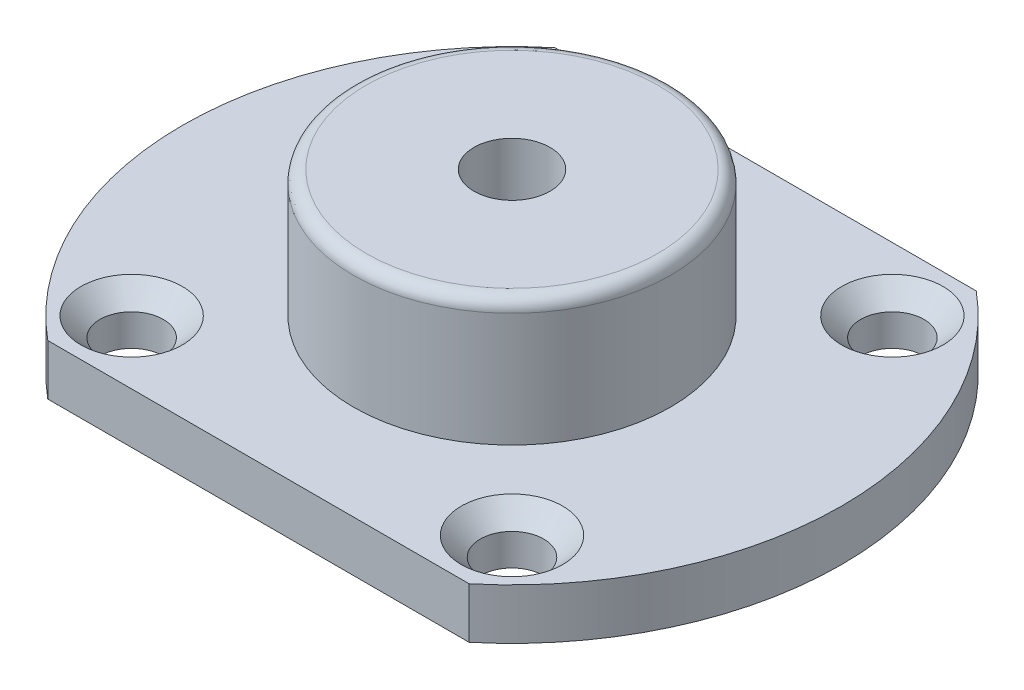
ISO-10303-21;
HEADER;
FILE_DESCRIPTION(('STEP AP214'),'2;1');
FILE_NAME('part.step','',(''),(''),'','','');
FILE_SCHEMA(('AUTOMOTIVE_DESIGN { 1 0 10303 214 1 1 1 1 }'));
ENDSEC;
DATA;
#1=APPLICATION_CONTEXT('core data for automotive mechanical design processes');
#2=APPLICATION_PROTOCOL_DEFINITION('international standard','automotive_design',2000,#1);
#3=PRODUCT_CONTEXT('',#1,'mechanical');
#4=PRODUCT('Part','Part','',(#3));
#5=PRODUCT_RELATED_PRODUCT_CATEGORY('part','',(#4));
#6=PRODUCT_DEFINITION_FORMATION('','',#4);
#7=PRODUCT_DEFINITION_CONTEXT('part definition',#1,'design');
#8=PRODUCT_DEFINITION('design','',#6,#7);
#9=PRODUCT_DEFINITION_SHAPE('','',#8);
#10=(LENGTH_UNIT() NAMED_UNIT(*) SI_UNIT(.MILLI.,.METRE.));
#11=(NAMED_UNIT(*) PLANE_ANGLE_UNIT() SI_UNIT($,.RADIAN.));
#12=(NAMED_UNIT(*) SI_UNIT($,.STERADIAN.) SOLID_ANGLE_UNIT());
#13=UNCERTAINTY_MEASURE_WITH_UNIT(LENGTH_MEASURE(1.E-05),#10,'distance_accuracy_value','');
#14=(GEOMETRIC_REPRESENTATION_CONTEXT(3) GLOBAL_UNCERTAINTY_ASSIGNED_CONTEXT((#13)) GLOBAL_UNIT_ASSIGNED_CONTEXT((#10,
#11,#12)) REPRESENTATION_CONTEXT('',''));
#15=CARTESIAN_POINT('',(0.,0.,0.));
#16=DIRECTION('',(0.,0.,1.));
#17=DIRECTION('',(1.,0.,0.));
#18=AXIS2_PLACEMENT_3D('',#15,#16,#17);
#19=CARTESIAN_POINT('',(0.,4.,0.));
#20=DIRECTION('',(0.,-1.,0.));
#21=DIRECTION('',(0.,0.,-1.));
#22=AXIS2_PLACEMENT_3D('',#19,#20,#21);
#23=CYLINDRICAL_SURFACE('',#22,26.);
#24=DIRECTION('',(0.,-1.,0.));
#25=VECTOR('',#24,1.);
#26=CARTESIAN_POINT('',(-16.6132477258362,4.,20.));
#27=LINE('',#26,#25);
#28=CARTESIAN_POINT('',(-16.6132477258362,4.,20.));
#29=VERTEX_POINT('',#28);
#30=CARTESIAN_POINT('',(-16.6132477258362,0.,20.));
#31=VERTEX_POINT('',#30);
#32=EDGE_CURVE('E67',#29,#31,#27,.T.);
#33=ORIENTED_EDGE('',*,*,#32,.F.);
#34=CARTESIAN_POINT('',(0.,4.,0.));
#35=DIRECTION('',(0.,1.,0.));
#36=DIRECTION('',(0.,0.,1.));
#37=AXIS2_PLACEMENT_3D('',#34,#35,#36);
#38=CIRCLE('',#37,26.);
#39=CARTESIAN_POINT('',(-16.6132477258362,4.,-20.));
#40=VERTEX_POINT('',#39);
#41=EDGE_CURVE('E118',#40,#29,#38,.T.);
#42=ORIENTED_EDGE('',*,*,#41,.F.);
#43=DIRECTION('',(0.,-1.,0.));
#44=VECTOR('',#43,1.);
#45=CARTESIAN_POINT('',(-16.6132477258362,4.,-20.));
#46=LINE('',#45,#44);
#47=CARTESIAN_POINT('',(-16.6132477258362,0.,-20.));
#48=VERTEX_POINT('',#47);
#49=EDGE_CURVE('E94',#48,#40,#46,.F.);
#50=ORIENTED_EDGE('',*,*,#49,.F.);
#51=CARTESIAN_POINT('',(0.,0.,0.));
#52=DIRECTION('',(0.,1.,0.));
#53=DIRECTION('',(0.,0.,1.));
#54=AXIS2_PLACEMENT_3D('',#51,#52,#53);
#55=CIRCLE('',#54,26.);
#56=EDGE_CURVE('E129',#48,#31,#55,.T.);
#57=ORIENTED_EDGE('',*,*,#56,.T.);
#58=EDGE_LOOP('',(#33,#42,#50,#57));
#59=FACE_BOUND('',#58,.T.);
#60=ADVANCED_FACE('F50',(#59),#23,.T.);
#61=DIRECTION('',(0.,-1.,0.));
#62=VECTOR('',#61,1.);
#63=CARTESIAN_POINT('',(16.6132477258362,4.,20.));
#64=LINE('',#63,#62);
#65=CARTESIAN_POINT('',(16.6132477258362,0.,20.));
#66=VERTEX_POINT('',#65);
#67=CARTESIAN_POINT('',(16.6132477258362,4.,20.));
#68=VERTEX_POINT('',#67);
#69=EDGE_CURVE('E112',#66,#68,#64,.F.);
#70=ORIENTED_EDGE('',*,*,#69,.F.);
#71=CARTESIAN_POINT('',(16.6132477258362,0.,-20.));
#72=VERTEX_POINT('',#71);
#73=EDGE_CURVE('E110',#66,#72,#55,.T.);
#74=ORIENTED_EDGE('',*,*,#73,.T.);
#75=DIRECTION('',(0.,-1.,0.));
#76=VECTOR('',#75,1.);
#77=CARTESIAN_POINT('',(16.6132477258362,4.,-20.));
#78=LINE('',#77,#76);
#79=CARTESIAN_POINT('',(16.6132477258362,4.,-20.));
#80=VERTEX_POINT('',#79);
#81=EDGE_CURVE('E75',#80,#72,#78,.T.);
#82=ORIENTED_EDGE('',*,*,#81,.F.);
#83=EDGE_CURVE('E108',#68,#80,#38,.T.);
#84=ORIENTED_EDGE('',*,*,#83,.F.);
#85=EDGE_LOOP('',(#70,#74,#82,#84));
#86=FACE_BOUND('',#85,.T.);
#87=ADVANCED_FACE('F107',(#86),#23,.T.);
#88=CARTESIAN_POINT('',(0.,4.,0.));
#89=DIRECTION('',(0.,1.,0.));
#90=DIRECTION('',(0.,0.,1.));
#91=AXIS2_PLACEMENT_3D('',#88,#89,#90);
#92=PLANE('',#91);
#93=CARTESIAN_POINT('',(15.,4.,-15.));
#94=DIRECTION('',(0.,1.,0.));
#95=DIRECTION('',(0.,0.,1.));
#96=AXIS2_PLACEMENT_3D('',#93,#94,#95);
#97=CIRCLE('',#96,3.99999999999998);
#98=CARTESIAN_POINT('',(15.,4.,-11.));
#99=VERTEX_POINT('',#98);
#100=EDGE_CURVE('E158',#99,#99,#97,.F.);
#101=ORIENTED_EDGE('',*,*,#100,.T.);
#102=EDGE_LOOP('',(#101));
#103=FACE_BOUND('',#102,.T.);
#104=CARTESIAN_POINT('',(15.,4.,15.));
#105=DIRECTION('',(0.,1.,0.));
#106=DIRECTION('',(0.,0.,1.));
#107=AXIS2_PLACEMENT_3D('',#104,#105,#106);
#108=CIRCLE('',#107,4.);
#109=CARTESIAN_POINT('',(15.,4.,19.));
#110=VERTEX_POINT('',#109);
#111=EDGE_CURVE('E154',#110,#110,#108,.F.);
#112=ORIENTED_EDGE('',*,*,#111,.T.);
#113=EDGE_LOOP('',(#112));
#114=FACE_BOUND('',#113,.T.);
#115=CARTESIAN_POINT('',(-15.,4.,15.));
#116=DIRECTION('',(0.,1.,0.));
#117=DIRECTION('',(0.,0.,1.));
#118=AXIS2_PLACEMENT_3D('',#115,#116,#117);
#119=CIRCLE('',#118,4.00000000000001);
#120=CARTESIAN_POINT('',(-15.,4.,19.));
#121=VERTEX_POINT('',#120);
#122=EDGE_CURVE('E150',#121,#121,#119,.F.);
#123=ORIENTED_EDGE('',*,*,#122,.T.);
#124=EDGE_LOOP('',(#123));
#125=FACE_BOUND('',#124,.T.);
#126=CARTESIAN_POINT('',(-15.,4.,-15.));
#127=DIRECTION('',(0.,1.,0.));
#128=DIRECTION('',(0.,0.,1.));
#129=AXIS2_PLACEMENT_3D('',#126,#127,#128);
#130=CIRCLE('',#129,4.00000000000001);
#131=CARTESIAN_POINT('',(-15.,4.,-11.));
#132=VERTEX_POINT('',#131);
#133=EDGE_CURVE('E146',#132,#132,#130,.F.);
#134=ORIENTED_EDGE('',*,*,#133,.T.);
#135=EDGE_LOOP('',(#134));
#136=FACE_BOUND('',#135,.T.);
#137=CARTESIAN_POINT('',(0.,4.,0.));
#138=DIRECTION('',(0.,1.,0.));
#139=DIRECTION('',(0.,0.,1.));
#140=AXIS2_PLACEMENT_3D('',#137,#138,#139);
#141=CIRCLE('',#140,12.5);
#142=CARTESIAN_POINT('',(0.,4.,12.5));
#143=VERTEX_POINT('',#142);
#144=EDGE_CURVE('E133',#143,#143,#141,.T.);
#145=ORIENTED_EDGE('',*,*,#144,.F.);
#146=EDGE_LOOP('',(#145));
#147=FACE_BOUND('',#146,.T.);
#148=ORIENTED_EDGE('',*,*,#41,.T.);
#149=DIRECTION('',(1.,0.,0.));
#150=VECTOR('',#149,1.);
#151=CARTESIAN_POINT('',(-32.8601013439083,4.,20.));
#152=LINE('',#151,#150);
#153=EDGE_CURVE('E100',#29,#68,#152,.T.);
#154=ORIENTED_EDGE('',*,*,#153,.T.);
#155=ORIENTED_EDGE('',*,*,#83,.T.);
#156=DIRECTION('',(-1.,0.,0.));
#157=VECTOR('',#156,1.);
#158=CARTESIAN_POINT('',(-32.8601013439084,4.,-20.));
#159=LINE('',#158,#157);
#160=EDGE_CURVE('E91',#80,#40,#159,.T.);
#161=ORIENTED_EDGE('',*,*,#160,.T.);
#162=EDGE_LOOP('',(#148,#154,#155,#161));
#163=FACE_BOUND('',#162,.T.);
#164=ADVANCED_FACE('F115',(#103,#114,#125,#136,#147,#163),#92,.T.);
#165=CARTESIAN_POINT('',(0.,0.,0.));
#166=DIRECTION('',(0.,1.,0.));
#167=DIRECTION('',(0.,0.,1.));
#168=AXIS2_PLACEMENT_3D('',#165,#166,#167);
#169=PLANE('',#168);
#170=CARTESIAN_POINT('',(-15.,-1.57859836313889E-13,15.));
#171=DIRECTION('',(0.,1.,0.));
#172=DIRECTION('',(0.,0.,1.));
#173=AXIS2_PLACEMENT_3D('',#170,#171,#172);
#174=CIRCLE('',#173,2.5);
#175=CARTESIAN_POINT('',(-15.,-1.57859836313889E-13,17.5));
#176=VERTEX_POINT('',#175);
#177=EDGE_CURVE('E244',#176,#176,#174,.F.);
#178=ORIENTED_EDGE('',*,*,#177,.F.);
#179=EDGE_LOOP('',(#178));
#180=FACE_BOUND('',#179,.T.);
#181=CARTESIAN_POINT('',(15.,-1.57859836313889E-13,15.));
#182=DIRECTION('',(0.,1.,0.));
#183=DIRECTION('',(0.,0.,1.));
#184=AXIS2_PLACEMENT_3D('',#181,#182,#183);
#185=CIRCLE('',#184,2.49999999999999);
#186=CARTESIAN_POINT('',(15.,-1.57859836313889E-13,17.5));
#187=VERTEX_POINT('',#186);
#188=EDGE_CURVE('E235',#187,#187,#185,.F.);
#189=ORIENTED_EDGE('',*,*,#188,.F.);
#190=EDGE_LOOP('',(#189));
#191=FACE_BOUND('',#190,.T.);
#192=CARTESIAN_POINT('',(15.,0.,-15.));
#193=DIRECTION('',(0.,1.,0.));
#194=DIRECTION('',(0.,0.,1.));
#195=AXIS2_PLACEMENT_3D('',#192,#193,#194);
#196=CIRCLE('',#195,2.49999999999999);
#197=CARTESIAN_POINT('',(15.,0.,-12.5));
#198=VERTEX_POINT('',#197);
#199=EDGE_CURVE('E231',#198,#198,#196,.F.);
#200=ORIENTED_EDGE('',*,*,#199,.F.);
#201=EDGE_LOOP('',(#200));
#202=FACE_BOUND('',#201,.T.);
#203=CARTESIAN_POINT('',(-15.,0.,-15.));
#204=DIRECTION('',(0.,1.,0.));
#205=DIRECTION('',(0.,0.,1.));
#206=AXIS2_PLACEMENT_3D('',#203,#204,#205);
#207=CIRCLE('',#206,2.5);
#208=CARTESIAN_POINT('',(-15.,0.,-12.5));
#209=VERTEX_POINT('',#208);
#210=EDGE_CURVE('E234',#209,#209,#207,.F.);
#211=ORIENTED_EDGE('',*,*,#210,.F.);
#212=EDGE_LOOP('',(#211));
#213=FACE_BOUND('',#212,.T.);
#214=CARTESIAN_POINT('',(0.,0.,0.));
#215=DIRECTION('',(0.,1.,0.));
#216=DIRECTION('',(0.,0.,1.));
#217=AXIS2_PLACEMENT_3D('',#214,#215,#216);
#218=CIRCLE('',#217,3.);
#219=CARTESIAN_POINT('',(0.,0.,3.));
#220=VERTEX_POINT('',#219);
#221=EDGE_CURVE('E101',#220,#220,#218,.F.);
#222=ORIENTED_EDGE('',*,*,#221,.F.);
#223=EDGE_LOOP('',(#222));
#224=FACE_BOUND('',#223,.T.);
#225=DIRECTION('',(1.,0.,0.));
#226=VECTOR('',#225,1.);
#227=CARTESIAN_POINT('',(0.,0.,20.));
#228=LINE('',#227,#226);
#229=EDGE_CURVE('E123',#31,#66,#228,.T.);
#230=ORIENTED_EDGE('',*,*,#229,.F.);
#231=ORIENTED_EDGE('',*,*,#56,.F.);
#232=DIRECTION('',(-1.,0.,0.));
#233=VECTOR('',#232,1.);
#234=CARTESIAN_POINT('',(0.,0.,-20.));
#235=LINE('',#234,#233);
#236=EDGE_CURVE('E117',#72,#48,#235,.T.);
#237=ORIENTED_EDGE('',*,*,#236,.F.);
#238=ORIENTED_EDGE('',*,*,#73,.F.);
#239=EDGE_LOOP('',(#230,#231,#237,#238));
#240=FACE_BOUND('',#239,.T.);
#241=ADVANCED_FACE('F195',(#180,#191,#202,#213,#224,#240),#169,.F.);
#242=CARTESIAN_POINT('',(-32.8601013439084,0.,-20.));
#243=DIRECTION('',(0.,0.,-1.));
#244=DIRECTION('',(-1.,0.,0.));
#245=AXIS2_PLACEMENT_3D('',#242,#243,#244);
#246=PLANE('',#245);
#247=ORIENTED_EDGE('',*,*,#81,.T.);
#248=ORIENTED_EDGE('',*,*,#236,.T.);
#249=ORIENTED_EDGE('',*,*,#49,.T.);
#250=ORIENTED_EDGE('',*,*,#160,.F.);
#251=EDGE_LOOP('',(#247,#248,#249,#250));
#252=FACE_BOUND('',#251,.T.);
#253=ADVANCED_FACE('F92',(#252),#246,.T.);
#254=CARTESIAN_POINT('',(-32.8601013439083,0.,20.));
#255=DIRECTION('',(0.,0.,1.));
#256=DIRECTION('',(1.,0.,0.));
#257=AXIS2_PLACEMENT_3D('',#254,#255,#256);
#258=PLANE('',#257);
#259=ORIENTED_EDGE('',*,*,#32,.T.);
#260=ORIENTED_EDGE('',*,*,#229,.T.);
#261=ORIENTED_EDGE('',*,*,#69,.T.);
#262=ORIENTED_EDGE('',*,*,#153,.F.);
#263=EDGE_LOOP('',(#259,#260,#261,#262));
#264=FACE_BOUND('',#263,.T.);
#265=ADVANCED_FACE('F271',(#264),#258,.T.);
#266=CARTESIAN_POINT('',(0.,14.,0.));
#267=DIRECTION('',(0.,-1.,0.));
#268=DIRECTION('',(0.,0.,-1.));
#269=AXIS2_PLACEMENT_3D('',#266,#267,#268);
#270=CYLINDRICAL_SURFACE('',#269,12.5);
#271=CARTESIAN_POINT('',(0.,13.,-1.57859836313889E-13));
#272=DIRECTION('',(0.,1.,0.));
#273=DIRECTION('',(0.,0.,1.));
#274=AXIS2_PLACEMENT_3D('',#271,#272,#273);
#275=CIRCLE('',#274,12.5);
#276=CARTESIAN_POINT('',(0.,13.,12.4999999999998));
#277=VERTEX_POINT('',#276);
#278=EDGE_CURVE('E138',#277,#277,#275,.F.);
#279=ORIENTED_EDGE('',*,*,#278,.T.);
#280=EDGE_LOOP('',(#279));
#281=FACE_BOUND('',#280,.T.);
#282=ORIENTED_EDGE('',*,*,#144,.T.);
#283=EDGE_LOOP('',(#282));
#284=FACE_BOUND('',#283,.T.);
#285=ADVANCED_FACE('F273',(#281,#284),#270,.T.);
#286=CARTESIAN_POINT('',(0.,14.,0.));
#287=DIRECTION('',(0.,1.,0.));
#288=DIRECTION('',(0.,0.,1.));
#289=AXIS2_PLACEMENT_3D('',#286,#287,#288);
#290=PLANE('',#289);
#291=CARTESIAN_POINT('',(0.,14.,0.));
#292=DIRECTION('',(0.,1.,0.));
#293=DIRECTION('',(0.,0.,1.));
#294=AXIS2_PLACEMENT_3D('',#291,#292,#293);
#295=CIRCLE('',#294,3.);
#296=CARTESIAN_POINT('',(0.,14.,3.));
#297=VERTEX_POINT('',#296);
#298=EDGE_CURVE('E241',#297,#297,#295,.T.);
#299=ORIENTED_EDGE('',*,*,#298,.F.);
#300=EDGE_LOOP('',(#299));
#301=FACE_BOUND('',#300,.T.);
#302=CARTESIAN_POINT('',(0.,14.,0.));
#303=DIRECTION('',(0.,1.,0.));
#304=DIRECTION('',(0.,0.,1.));
#305=AXIS2_PLACEMENT_3D('',#302,#303,#304);
#306=CIRCLE('',#305,11.5);
#307=CARTESIAN_POINT('',(0.,14.,11.5));
#308=VERTEX_POINT('',#307);
#309=EDGE_CURVE('E134',#308,#308,#306,.T.);
#310=ORIENTED_EDGE('',*,*,#309,.T.);
#311=EDGE_LOOP('',(#310));
#312=FACE_BOUND('',#311,.T.);
#313=ADVANCED_FACE('F201',(#301,#312),#290,.T.);
#314=CARTESIAN_POINT('',(0.,13.,-1.57859836313889E-13));
#315=DIRECTION('',(0.,1.,0.));
#316=DIRECTION('',(0.,0.,1.));
#317=AXIS2_PLACEMENT_3D('',#314,#315,#316);
#318=TOROIDAL_SURFACE('',#317,11.5,1.);
#319=ORIENTED_EDGE('',*,*,#278,.F.);
#320=EDGE_LOOP('',(#319));
#321=FACE_BOUND('',#320,.T.);
#322=ORIENTED_EDGE('',*,*,#309,.F.);
#323=EDGE_LOOP('',(#322));
#324=FACE_BOUND('',#323,.T.);
#325=ADVANCED_FACE('F197',(#321,#324),#318,.T.);
#326=CARTESIAN_POINT('',(0.,-0.000999999999999265,0.));
#327=DIRECTION('',(0.,1.,0.));
#328=DIRECTION('',(0.,0.,1.));
#329=AXIS2_PLACEMENT_3D('',#326,#327,#328);
#330=CYLINDRICAL_SURFACE('',#329,3.);
#331=CARTESIAN_POINT('',(0.,14.,3.));
#332=CARTESIAN_POINT('',(0.,13.8541666666667,3.));
#333=CARTESIAN_POINT('',(0.,13.7083333333333,3.));
#334=CARTESIAN_POINT('',(0.,13.4166666666667,3.));
#335=CARTESIAN_POINT('',(0.,13.2708333333333,3.));
#336=CARTESIAN_POINT('',(0.,12.9791666666667,3.));
#337=CARTESIAN_POINT('',(0.,12.8333333333333,3.));
#338=CARTESIAN_POINT('',(0.,12.5416666666667,3.));
#339=CARTESIAN_POINT('',(0.,12.3958333333333,3.));
#340=CARTESIAN_POINT('',(0.,12.1041666666667,3.));
#341=CARTESIAN_POINT('',(0.,11.9583333333333,3.));
#342=CARTESIAN_POINT('',(0.,11.6666666666667,3.));
#343=CARTESIAN_POINT('',(0.,11.5208333333333,3.));
#344=CARTESIAN_POINT('',(0.,11.2291666666667,3.));
#345=CARTESIAN_POINT('',(0.,11.0833333333333,3.));
#346=CARTESIAN_POINT('',(0.,10.7916666666667,3.));
#347=CARTESIAN_POINT('',(0.,10.6458333333333,3.));
#348=CARTESIAN_POINT('',(0.,10.3541666666667,3.));
#349=CARTESIAN_POINT('',(0.,10.2083333333333,3.));
#350=CARTESIAN_POINT('',(0.,9.91666666666667,3.));
#351=CARTESIAN_POINT('',(0.,9.77083333333333,3.));
#352=CARTESIAN_POINT('',(0.,9.47916666666667,3.));
#353=CARTESIAN_POINT('',(0.,9.33333333333333,3.));
#354=CARTESIAN_POINT('',(0.,9.04166666666667,3.));
#355=CARTESIAN_POINT('',(0.,8.89583333333333,3.));
#356=CARTESIAN_POINT('',(0.,8.60416666666667,3.));
#357=CARTESIAN_POINT('',(0.,8.45833333333333,3.));
#358=CARTESIAN_POINT('',(0.,8.16666666666667,3.));
#359=CARTESIAN_POINT('',(0.,8.02083333333333,3.));
#360=CARTESIAN_POINT('',(0.,7.72916666666667,3.));
#361=CARTESIAN_POINT('',(0.,7.58333333333333,3.));
#362=CARTESIAN_POINT('',(0.,7.29166666666667,3.));
#363=CARTESIAN_POINT('',(0.,7.14583333333333,3.));
#364=CARTESIAN_POINT('',(0.,6.85416666666667,3.));
#365=CARTESIAN_POINT('',(0.,6.70833333333333,3.));
#366=CARTESIAN_POINT('',(0.,6.41666666666667,3.));
#367=CARTESIAN_POINT('',(0.,6.27083333333333,3.));
#368=CARTESIAN_POINT('',(0.,5.97916666666667,3.));
#369=CARTESIAN_POINT('',(0.,5.83333333333333,3.));
#370=CARTESIAN_POINT('',(0.,5.54166666666667,3.));
#371=CARTESIAN_POINT('',(0.,5.39583333333333,3.));
#372=CARTESIAN_POINT('',(0.,5.10416666666667,3.));
#373=CARTESIAN_POINT('',(0.,4.95833333333333,3.));
#374=CARTESIAN_POINT('',(0.,4.66666666666667,3.));
#375=CARTESIAN_POINT('',(0.,4.52083333333333,3.));
#376=CARTESIAN_POINT('',(0.,4.22916666666667,3.));
#377=CARTESIAN_POINT('',(0.,4.08333333333333,3.));
#378=CARTESIAN_POINT('',(0.,3.79166666666667,3.));
#379=CARTESIAN_POINT('',(0.,3.64583333333333,3.));
#380=CARTESIAN_POINT('',(0.,3.35416666666667,3.));
#381=CARTESIAN_POINT('',(0.,3.20833333333333,3.));
#382=CARTESIAN_POINT('',(0.,2.91666666666667,3.));
#383=CARTESIAN_POINT('',(0.,2.77083333333333,3.));
#384=CARTESIAN_POINT('',(0.,2.47916666666667,3.));
#385=CARTESIAN_POINT('',(0.,2.33333333333333,3.));
#386=CARTESIAN_POINT('',(0.,2.04166666666667,3.));
#387=CARTESIAN_POINT('',(0.,1.89583333333333,3.));
#388=CARTESIAN_POINT('',(0.,1.60416666666667,3.));
#389=CARTESIAN_POINT('',(0.,1.45833333333333,3.));
#390=CARTESIAN_POINT('',(0.,1.16666666666667,3.));
#391=CARTESIAN_POINT('',(0.,1.02083333333333,3.));
#392=CARTESIAN_POINT('',(0.,0.729166666666667,3.));
#393=CARTESIAN_POINT('',(0.,0.583333333333334,3.));
#394=CARTESIAN_POINT('',(0.,0.291666666666667,3.));
#395=CARTESIAN_POINT('',(0.,0.145833333333333,3.));
#396=CARTESIAN_POINT('',(0.,0.,3.));
#397=B_SPLINE_CURVE_WITH_KNOTS('',3,(#331,#332,#333,#334,#335,#336,#337,#338,#339,#340,#341,
#342,#343,#344,#345,#346,#347,#348,#349,#350,#351,#352,#353,#354,#355,#356,#357,#358,#359,#360,
#361,#362,#363,#364,#365,#366,#367,#368,#369,#370,#371,#372,#373,#374,#375,#376,#377,#378,#379,
#380,#381,#382,#383,#384,#385,#386,#387,#388,#389,#390,#391,#392,#393,#394,#395,#396),
.UNSPECIFIED.,.F.,.F.,(4,2,2,2,2,2,2,2,2,2,2,2,2,2,2,2,2,2,2,2,2,2,2,2,2,2,2,2,2,2,2,2,4),(0.,
0.4375,0.875000000000001,1.3125,1.75,2.1875,2.625,3.0625,3.5,3.9375,4.375,4.8125,5.25,5.6875,
6.125,6.5625,7.,7.4375,7.875,8.3125,8.75,9.1875,9.625,10.0625,10.5,10.9375,11.375,11.8125,12.25,
12.6875,13.125,13.5625,14.),.UNSPECIFIED.);
#398=EDGE_CURVE('BSEAM200',#297,#220,#397,.T.);
#399=ORIENTED_EDGE('',*,*,#298,.T.);
#400=ORIENTED_EDGE('',*,*,#221,.T.);
#401=ORIENTED_EDGE('',*,*,#398,.T.);
#402=ORIENTED_EDGE('',*,*,#398,.F.);
#403=EDGE_LOOP('',(#399,#401,#400,#402));
#404=FACE_BOUND('',#403,.T.);
#405=ADVANCED_FACE('F200',(#404),#330,.F.);
#406=CARTESIAN_POINT('',(-15.,-0.001000000000001,-15.));
#407=DIRECTION('',(0.,1.,0.));
#408=DIRECTION('',(0.,0.,1.));
#409=AXIS2_PLACEMENT_3D('',#406,#407,#408);
#410=CYLINDRICAL_SURFACE('',#409,2.5);
#411=CARTESIAN_POINT('',(-15.,2.49999999999999,-15.));
#412=DIRECTION('',(0.,1.,0.));
#413=DIRECTION('',(0.,0.,1.));
#414=AXIS2_PLACEMENT_3D('',#411,#412,#413);
#415=CIRCLE('',#414,2.5);
#416=CARTESIAN_POINT('',(-15.,2.49999999999999,-12.5));
#417=VERTEX_POINT('',#416);
#418=EDGE_CURVE('E12',#417,#417,#415,.T.);
#419=ORIENTED_EDGE('',*,*,#418,.T.);
#420=EDGE_LOOP('',(#419));
#421=FACE_BOUND('',#420,.T.);
#422=ORIENTED_EDGE('',*,*,#210,.T.);
#423=EDGE_LOOP('',(#422));
#424=FACE_BOUND('',#423,.T.);
#425=ADVANCED_FACE('F227',(#421,#424),#410,.F.);
#426=CARTESIAN_POINT('',(15.,-0.001000000000001,-15.));
#427=DIRECTION('',(0.,1.,0.));
#428=DIRECTION('',(0.,0.,1.));
#429=AXIS2_PLACEMENT_3D('',#426,#427,#428);
#430=CYLINDRICAL_SURFACE('',#429,2.49999999999999);
#431=CARTESIAN_POINT('',(15.,2.50000000000002,-15.));
#432=DIRECTION('',(0.,1.,0.));
#433=DIRECTION('',(0.,0.,1.));
#434=AXIS2_PLACEMENT_3D('',#431,#432,#433);
#435=CIRCLE('',#434,2.49999999999999);
#436=CARTESIAN_POINT('',(15.,2.50000000000002,-12.5));
#437=VERTEX_POINT('',#436);
#438=EDGE_CURVE('E142',#437,#437,#435,.T.);
#439=ORIENTED_EDGE('',*,*,#438,.T.);
#440=EDGE_LOOP('',(#439));
#441=FACE_BOUND('',#440,.T.);
#442=ORIENTED_EDGE('',*,*,#199,.T.);
#443=EDGE_LOOP('',(#442));
#444=FACE_BOUND('',#443,.T.);
#445=ADVANCED_FACE('F224',(#441,#444),#430,.F.);
#446=CARTESIAN_POINT('',(15.,-0.00100000000015713,15.));
#447=DIRECTION('',(0.,1.,0.));
#448=DIRECTION('',(0.,0.,1.));
#449=AXIS2_PLACEMENT_3D('',#446,#447,#448);
#450=CYLINDRICAL_SURFACE('',#449,2.49999999999999);
#451=CARTESIAN_POINT('',(15.,2.5,15.));
#452=DIRECTION('',(0.,1.,0.));
#453=DIRECTION('',(0.,0.,1.));
#454=AXIS2_PLACEMENT_3D('',#451,#452,#453);
#455=CIRCLE('',#454,2.49999999999999);
#456=CARTESIAN_POINT('',(15.,2.5,17.5));
#457=VERTEX_POINT('',#456);
#458=EDGE_CURVE('E162',#457,#457,#455,.T.);
#459=ORIENTED_EDGE('',*,*,#458,.T.);
#460=EDGE_LOOP('',(#459));
#461=FACE_BOUND('',#460,.T.);
#462=ORIENTED_EDGE('',*,*,#188,.T.);
#463=EDGE_LOOP('',(#462));
#464=FACE_BOUND('',#463,.T.);
#465=ADVANCED_FACE('F218',(#461,#464),#450,.F.);
#466=CARTESIAN_POINT('',(-15.,-0.00100000000015713,15.));
#467=DIRECTION('',(0.,1.,0.));
#468=DIRECTION('',(0.,0.,1.));
#469=AXIS2_PLACEMENT_3D('',#466,#467,#468);
#470=CYLINDRICAL_SURFACE('',#469,2.5);
#471=CARTESIAN_POINT('',(-15.,2.49999999999999,15.));
#472=DIRECTION('',(0.,1.,0.));
#473=DIRECTION('',(0.,0.,1.));
#474=AXIS2_PLACEMENT_3D('',#471,#472,#473);
#475=CIRCLE('',#474,2.5);
#476=CARTESIAN_POINT('',(-15.,2.49999999999999,17.5));
#477=VERTEX_POINT('',#476);
#478=EDGE_CURVE('E60',#477,#477,#475,.T.);
#479=ORIENTED_EDGE('',*,*,#478,.T.);
#480=EDGE_LOOP('',(#479));
#481=FACE_BOUND('',#480,.T.);
#482=ORIENTED_EDGE('',*,*,#177,.T.);
#483=EDGE_LOOP('',(#482));
#484=FACE_BOUND('',#483,.T.);
#485=ADVANCED_FACE('F170',(#481,#484),#470,.F.);
#486=CARTESIAN_POINT('',(15.,2.50000000000002,-15.));
#487=DIRECTION('',(0.,1.,0.));
#488=DIRECTION('',(0.,0.,1.));
#489=AXIS2_PLACEMENT_3D('',#486,#487,#488);
#490=CONICAL_SURFACE('',#489,2.49999999999999,0.78539816339745);
#491=ORIENTED_EDGE('',*,*,#100,.F.);
#492=EDGE_LOOP('',(#491));
#493=FACE_BOUND('',#492,.T.);
#494=ORIENTED_EDGE('',*,*,#438,.F.);
#495=EDGE_LOOP('',(#494));
#496=FACE_BOUND('',#495,.T.);
#497=ADVANCED_FACE('F182',(#493,#496),#490,.F.);
#498=CARTESIAN_POINT('',(15.,2.5,15.));
#499=DIRECTION('',(0.,1.,0.));
#500=DIRECTION('',(0.,0.,1.));
#501=AXIS2_PLACEMENT_3D('',#498,#499,#500);
#502=CONICAL_SURFACE('',#501,2.49999999999999,0.78539816339745);
#503=ORIENTED_EDGE('',*,*,#111,.F.);
#504=EDGE_LOOP('',(#503));
#505=FACE_BOUND('',#504,.T.);
#506=ORIENTED_EDGE('',*,*,#458,.F.);
#507=EDGE_LOOP('',(#506));
#508=FACE_BOUND('',#507,.T.);
#509=ADVANCED_FACE('F175',(#505,#508),#502,.F.);
#510=CARTESIAN_POINT('',(-15.,2.49999999999999,15.));
#511=DIRECTION('',(0.,1.,0.));
#512=DIRECTION('',(0.,0.,1.));
#513=AXIS2_PLACEMENT_3D('',#510,#511,#512);
#514=CONICAL_SURFACE('',#513,2.5,0.785398163397448);
#515=CARTESIAN_POINT('',(-15.,4.,19.));
#516=CARTESIAN_POINT('',(-15.,3.984375,18.984375));
#517=CARTESIAN_POINT('',(-15.,3.96875,18.96875));
#518=CARTESIAN_POINT('',(-15.,3.9375,18.9375));
#519=CARTESIAN_POINT('',(-15.,3.921875,18.921875));
#520=CARTESIAN_POINT('',(-15.,3.890625,18.890625));
#521=CARTESIAN_POINT('',(-15.,3.875,18.875));
#522=CARTESIAN_POINT('',(-15.,3.84375,18.84375));
#523=CARTESIAN_POINT('',(-15.,3.828125,18.828125));
#524=CARTESIAN_POINT('',(-15.,3.796875,18.796875));
#525=CARTESIAN_POINT('',(-15.,3.78125,18.78125));
#526=CARTESIAN_POINT('',(-15.,3.75,18.75));
#527=CARTESIAN_POINT('',(-15.,3.734375,18.734375));
#528=CARTESIAN_POINT('',(-15.,3.703125,18.703125));
#529=CARTESIAN_POINT('',(-15.,3.6875,18.6875));
#530=CARTESIAN_POINT('',(-15.,3.65625,18.65625));
#531=CARTESIAN_POINT('',(-15.,3.640625,18.640625));
#532=CARTESIAN_POINT('',(-15.,3.609375,18.609375));
#533=CARTESIAN_POINT('',(-15.,3.59375,18.59375));
#534=CARTESIAN_POINT('',(-15.,3.5625,18.5625));
#535=CARTESIAN_POINT('',(-15.,3.546875,18.546875));
#536=CARTESIAN_POINT('',(-15.,3.515625,18.515625));
#537=CARTESIAN_POINT('',(-15.,3.5,18.5));
#538=CARTESIAN_POINT('',(-15.,3.46875,18.46875));
#539=CARTESIAN_POINT('',(-15.,3.45312499999999,18.453125));
#540=CARTESIAN_POINT('',(-15.,3.42187499999999,18.421875));
#541=CARTESIAN_POINT('',(-15.,3.40625,18.40625));
#542=CARTESIAN_POINT('',(-15.,3.37499999999999,18.375));
#543=CARTESIAN_POINT('',(-15.,3.35937499999999,18.359375));
#544=CARTESIAN_POINT('',(-15.,3.32812499999999,18.328125));
#545=CARTESIAN_POINT('',(-15.,3.31249999999999,18.3125));
#546=CARTESIAN_POINT('',(-15.,3.28124999999999,18.28125));
#547=CARTESIAN_POINT('',(-15.,3.26562499999999,18.265625));
#548=CARTESIAN_POINT('',(-15.,3.23437499999999,18.234375));
#549=CARTESIAN_POINT('',(-15.,3.21874999999999,18.21875));
#550=CARTESIAN_POINT('',(-15.,3.18749999999999,18.1875));
#551=CARTESIAN_POINT('',(-15.,3.17187499999999,18.171875));
#552=CARTESIAN_POINT('',(-15.,3.14062499999999,18.140625));
#553=CARTESIAN_POINT('',(-15.,3.12499999999999,18.125));
#554=CARTESIAN_POINT('',(-15.,3.09374999999999,18.09375));
#555=CARTESIAN_POINT('',(-15.,3.07812499999999,18.078125));
#556=CARTESIAN_POINT('',(-15.,3.04687499999999,18.046875));
#557=CARTESIAN_POINT('',(-15.,3.03124999999999,18.03125));
#558=CARTESIAN_POINT('',(-15.,2.99999999999999,18.));
#559=CARTESIAN_POINT('',(-15.,2.98437499999999,17.984375));
#560=CARTESIAN_POINT('',(-15.,2.95312499999999,17.953125));
#561=CARTESIAN_POINT('',(-15.,2.93749999999999,17.9375));
#562=CARTESIAN_POINT('',(-15.,2.90624999999999,17.90625));
#563=CARTESIAN_POINT('',(-15.,2.89062499999999,17.890625));
#564=CARTESIAN_POINT('',(-15.,2.85937499999999,17.859375));
#565=CARTESIAN_POINT('',(-15.,2.84374999999999,17.84375));
#566=CARTESIAN_POINT('',(-15.,2.81249999999999,17.8125));
#567=CARTESIAN_POINT('',(-15.,2.79687499999999,17.796875));
#568=CARTESIAN_POINT('',(-15.,2.76562499999999,17.765625));
#569=CARTESIAN_POINT('',(-15.,2.74999999999999,17.75));
#570=CARTESIAN_POINT('',(-15.,2.71874999999999,17.71875));
#571=CARTESIAN_POINT('',(-15.,2.70312499999999,17.703125));
#572=CARTESIAN_POINT('',(-15.,2.67187499999999,17.671875));
#573=CARTESIAN_POINT('',(-15.,2.65624999999999,17.65625));
#574=CARTESIAN_POINT('',(-15.,2.62499999999999,17.625));
#575=CARTESIAN_POINT('',(-15.,2.60937499999999,17.609375));
#576=CARTESIAN_POINT('',(-15.,2.57812499999999,17.578125));
#577=CARTESIAN_POINT('',(-15.,2.56249999999999,17.5625));
#578=CARTESIAN_POINT('',(-15.,2.53124999999999,17.53125));
#579=CARTESIAN_POINT('',(-15.,2.51562499999999,17.515625));
#580=CARTESIAN_POINT('',(-15.,2.49999999999999,17.5));
#581=B_SPLINE_CURVE_WITH_KNOTS('',3,(#515,#516,#517,#518,#519,#520,#521,#522,#523,#524,#525,
#526,#527,#528,#529,#530,#531,#532,#533,#534,#535,#536,#537,#538,#539,#540,#541,#542,#543,#544,
#545,#546,#547,#548,#549,#550,#551,#552,#553,#554,#555,#556,#557,#558,#559,#560,#561,#562,#563,
#564,#565,#566,#567,#568,#569,#570,#571,#572,#573,#574,#575,#576,#577,#578,#579,#580),
.UNSPECIFIED.,.F.,.F.,(4,2,2,2,2,2,2,2,2,2,2,2,2,2,2,2,2,2,2,2,2,2,2,2,2,2,2,2,2,2,2,2,4),(0.,
0.0662912607362401,0.132582521472478,0.198873782208718,0.265165042944956,0.331456303681197,
0.397747564417437,0.464038825153675,0.530330085889915,0.596621346626153,0.662912607362394,
0.729203868098634,0.795495128834872,0.861786389571112,0.92807765030735,0.99436891104359,
1.06066017177983,1.12695143251607,1.19324269325231,1.25953395398855,1.32582521472479,
1.39211647546102,1.45840773619726,1.5246989969335,1.59099025766974,1.65728151840598,
1.72357277914222,1.78986403987846,1.8561553006147,1.92244656135094,1.98873782208718,
2.05502908282342,2.12132034355966),.UNSPECIFIED.);
#582=EDGE_CURVE('BSEAM173',#121,#477,#581,.T.);
#583=ORIENTED_EDGE('',*,*,#122,.F.);
#584=ORIENTED_EDGE('',*,*,#478,.F.);
#585=ORIENTED_EDGE('',*,*,#582,.T.);
#586=ORIENTED_EDGE('',*,*,#582,.F.);
#587=EDGE_LOOP('',(#583,#585,#584,#586));
#588=FACE_BOUND('',#587,.T.);
#589=ADVANCED_FACE('F173',(#588),#514,.F.);
#590=CARTESIAN_POINT('',(-15.,2.49999999999999,-15.));
#591=DIRECTION('',(0.,1.,0.));
#592=DIRECTION('',(0.,0.,1.));
#593=AXIS2_PLACEMENT_3D('',#590,#591,#592);
#594=CONICAL_SURFACE('',#593,2.5,0.785398163397448);
#595=ORIENTED_EDGE('',*,*,#133,.F.);
#596=EDGE_LOOP('',(#595));
#597=FACE_BOUND('',#596,.T.);
#598=ORIENTED_EDGE('',*,*,#418,.F.);
#599=EDGE_LOOP('',(#598));
#600=FACE_BOUND('',#599,.T.);
#601=ADVANCED_FACE('F53',(#597,#600),#594,.F.);
#602=CLOSED_SHELL('',(#60,#87,#164,#241,#253,#265,#285,#313,#325,#405,#425,#445,#465,#485,#497,
#509,#589,#601));
#603=MANIFOLD_SOLID_BREP('B2',#602);
#604=ADVANCED_BREP_SHAPE_REPRESENTATION('',(#18,#603),#14);
#605=SHAPE_DEFINITION_REPRESENTATION(#9,#604);
ENDSEC;
END-ISO-10303-21;
